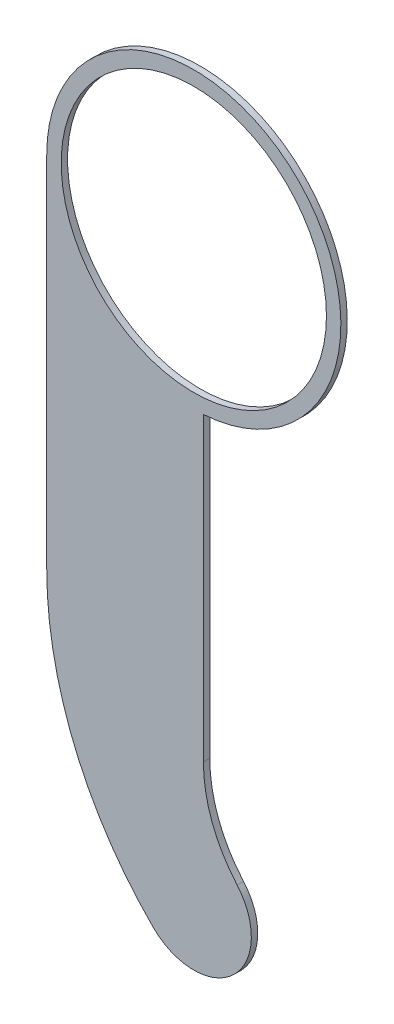
ISO-10303-21;
HEADER;
FILE_DESCRIPTION(('STEP AP214'),'2;1');
FILE_NAME('part.step','',(''),(''),'','','');
FILE_SCHEMA(('AUTOMOTIVE_DESIGN { 1 0 10303 214 1 1 1 1 }'));
ENDSEC;
DATA;
#1=APPLICATION_CONTEXT('core data for automotive mechanical design processes');
#2=APPLICATION_PROTOCOL_DEFINITION('international standard','automotive_design',2000,#1);
#3=PRODUCT_CONTEXT('',#1,'mechanical');
#4=PRODUCT('Part','Part','',(#3));
#5=PRODUCT_RELATED_PRODUCT_CATEGORY('part','',(#4));
#6=PRODUCT_DEFINITION_FORMATION('','',#4);
#7=PRODUCT_DEFINITION_CONTEXT('part definition',#1,'design');
#8=PRODUCT_DEFINITION('design','',#6,#7);
#9=PRODUCT_DEFINITION_SHAPE('','',#8);
#10=(LENGTH_UNIT() NAMED_UNIT(*) SI_UNIT(.MILLI.,.METRE.));
#11=(NAMED_UNIT(*) PLANE_ANGLE_UNIT() SI_UNIT($,.RADIAN.));
#12=(NAMED_UNIT(*) SI_UNIT($,.STERADIAN.) SOLID_ANGLE_UNIT());
#13=UNCERTAINTY_MEASURE_WITH_UNIT(LENGTH_MEASURE(1.E-05),#10,'distance_accuracy_value','');
#14=(GEOMETRIC_REPRESENTATION_CONTEXT(3) GLOBAL_UNCERTAINTY_ASSIGNED_CONTEXT((#13)) GLOBAL_UNIT_ASSIGNED_CONTEXT((#10,
#11,#12)) REPRESENTATION_CONTEXT('',''));
#15=CARTESIAN_POINT('',(0.,0.,0.));
#16=DIRECTION('',(0.,0.,1.));
#17=DIRECTION('',(1.,0.,0.));
#18=AXIS2_PLACEMENT_3D('',#15,#16,#17);
#19=CARTESIAN_POINT('',(45.6573360160041,-140.066053532363,2.));
#20=DIRECTION('',(0.,0.,-1.));
#21=DIRECTION('',(-1.,0.,0.));
#22=AXIS2_PLACEMENT_3D('',#19,#20,#21);
#23=PLANE('',#22);
#24=CARTESIAN_POINT('',(45.6573360160041,-140.066053532363,2.));
#25=DIRECTION('',(0.,0.,-1.));
#26=DIRECTION('',(-1.,0.,0.));
#27=AXIS2_PLACEMENT_3D('',#24,#25,#26);
#28=CIRCLE('',#27,42.6573360160041);
#29=CARTESIAN_POINT('',(13.5487659410436,-168.149643824981,2.));
#30=VERTEX_POINT('',#29);
#31=CARTESIAN_POINT('',(3.00000000000001,-140.066053532363,2.));
#32=VERTEX_POINT('',#31);
#33=EDGE_CURVE('E146',#30,#32,#28,.T.);
#34=ORIENTED_EDGE('',*,*,#33,.T.);
#35=DIRECTION('',(0.,1.,0.));
#36=VECTOR('',#35,1.);
#37=CARTESIAN_POINT('',(3.00000000000001,-140.066053532363,2.));
#38=LINE('',#37,#36);
#39=CARTESIAN_POINT('',(3.00000000000004,-45.9188278959344,2.));
#40=VERTEX_POINT('',#39);
#41=EDGE_CURVE('E94',#32,#40,#38,.T.);
#42=ORIENTED_EDGE('',*,*,#41,.T.);
#43=CARTESIAN_POINT('',(0.,0.,2.));
#44=DIRECTION('',(0.,0.,1.));
#45=DIRECTION('',(-1.,0.,0.));
#46=AXIS2_PLACEMENT_3D('',#43,#44,#45);
#47=CIRCLE('',#46,46.0167225618736);
#48=CARTESIAN_POINT('',(-46.0167225618736,0.,2.));
#49=VERTEX_POINT('',#48);
#50=EDGE_CURVE('E107',#40,#49,#47,.T.);
#51=ORIENTED_EDGE('',*,*,#50,.T.);
#52=DIRECTION('',(0.,-1.,0.));
#53=VECTOR('',#52,1.);
#54=CARTESIAN_POINT('',(-46.0167225618736,-112.361648417881,2.));
#55=LINE('',#54,#53);
#56=CARTESIAN_POINT('',(-46.0167225618736,-112.361648417881,2.));
#57=VERTEX_POINT('',#56);
#58=EDGE_CURVE('E101',#49,#57,#55,.T.);
#59=ORIENTED_EDGE('',*,*,#58,.T.);
#60=CARTESIAN_POINT('',(67.6383515821177,-112.361648417881,2.));
#61=DIRECTION('',(0.,0.,1.));
#62=DIRECTION('',(-1.,0.,0.));
#63=AXIS2_PLACEMENT_3D('',#60,#61,#62);
#64=CIRCLE('',#63,113.655074143991);
#65=CARTESIAN_POINT('',(-12.7279220613578,-192.727922061358,2.));
#66=VERTEX_POINT('',#65);
#67=EDGE_CURVE('E105',#57,#66,#64,.T.);
#68=ORIENTED_EDGE('',*,*,#67,.T.);
#69=CARTESIAN_POINT('',(0.,-180.,2.));
#70=DIRECTION('',(0.,0.,1.));
#71=DIRECTION('',(1.,0.,0.));
#72=AXIS2_PLACEMENT_3D('',#69,#70,#71);
#73=CIRCLE('',#72,18.);
#74=EDGE_CURVE('E57',#66,#30,#73,.T.);
#75=ORIENTED_EDGE('',*,*,#74,.T.);
#76=EDGE_LOOP('',(#34,#42,#51,#59,#68,#75));
#77=FACE_BOUND('',#76,.T.);
#78=CARTESIAN_POINT('',(0.,0.,2.));
#79=DIRECTION('',(0.,0.,1.));
#80=DIRECTION('',(1.,0.,0.));
#81=AXIS2_PLACEMENT_3D('',#78,#79,#80);
#82=CIRCLE('',#81,41.5);
#83=CARTESIAN_POINT('',(41.5,0.,2.));
#84=VERTEX_POINT('',#83);
#85=EDGE_CURVE('E134',#84,#84,#82,.T.);
#86=ORIENTED_EDGE('',*,*,#85,.F.);
#87=EDGE_LOOP('',(#86));
#88=FACE_BOUND('',#87,.T.);
#89=ADVANCED_FACE('F39',(#77,#88),#23,.F.);
#90=CARTESIAN_POINT('',(45.6573360160041,-140.066053532363,0.));
#91=DIRECTION('',(0.,0.,-1.));
#92=DIRECTION('',(-1.,0.,0.));
#93=AXIS2_PLACEMENT_3D('',#90,#91,#92);
#94=PLANE('',#93);
#95=CARTESIAN_POINT('',(45.6573360160041,-140.066053532363,0.));
#96=DIRECTION('',(0.,0.,-1.));
#97=DIRECTION('',(-1.,0.,0.));
#98=AXIS2_PLACEMENT_3D('',#95,#96,#97);
#99=CIRCLE('',#98,42.6573360160041);
#100=CARTESIAN_POINT('',(13.5487659410436,-168.149643824981,0.));
#101=VERTEX_POINT('',#100);
#102=CARTESIAN_POINT('',(3.00000000000001,-140.066053532363,0.));
#103=VERTEX_POINT('',#102);
#104=EDGE_CURVE('E129',#101,#103,#99,.T.);
#105=ORIENTED_EDGE('',*,*,#104,.F.);
#106=CARTESIAN_POINT('',(0.,-180.,0.));
#107=DIRECTION('',(0.,0.,1.));
#108=DIRECTION('',(1.,0.,0.));
#109=AXIS2_PLACEMENT_3D('',#106,#107,#108);
#110=CIRCLE('',#109,18.);
#111=CARTESIAN_POINT('',(-12.7279220613578,-192.727922061358,0.));
#112=VERTEX_POINT('',#111);
#113=EDGE_CURVE('E86',#112,#101,#110,.T.);
#114=ORIENTED_EDGE('',*,*,#113,.F.);
#115=CARTESIAN_POINT('',(67.6383515821177,-112.361648417881,0.));
#116=DIRECTION('',(0.,0.,1.));
#117=DIRECTION('',(-1.,0.,0.));
#118=AXIS2_PLACEMENT_3D('',#115,#116,#117);
#119=CIRCLE('',#118,113.655074143991);
#120=CARTESIAN_POINT('',(-46.0167225618736,-112.361648417881,0.));
#121=VERTEX_POINT('',#120);
#122=EDGE_CURVE('E80',#121,#112,#119,.T.);
#123=ORIENTED_EDGE('',*,*,#122,.F.);
#124=DIRECTION('',(0.,-1.,0.));
#125=VECTOR('',#124,1.);
#126=CARTESIAN_POINT('',(-46.0167225618736,-112.361648417881,0.));
#127=LINE('',#126,#125);
#128=CARTESIAN_POINT('',(-46.0167225618736,0.,0.));
#129=VERTEX_POINT('',#128);
#130=EDGE_CURVE('E116',#129,#121,#127,.T.);
#131=ORIENTED_EDGE('',*,*,#130,.F.);
#132=CARTESIAN_POINT('',(0.,0.,0.));
#133=DIRECTION('',(0.,0.,1.));
#134=DIRECTION('',(-1.,0.,0.));
#135=AXIS2_PLACEMENT_3D('',#132,#133,#134);
#136=CIRCLE('',#135,46.0167225618736);
#137=CARTESIAN_POINT('',(3.00000000000004,-45.9188278959344,0.));
#138=VERTEX_POINT('',#137);
#139=EDGE_CURVE('E137',#138,#129,#136,.T.);
#140=ORIENTED_EDGE('',*,*,#139,.F.);
#141=DIRECTION('',(0.,1.,0.));
#142=VECTOR('',#141,1.);
#143=CARTESIAN_POINT('',(3.00000000000001,-140.066053532363,0.));
#144=LINE('',#143,#142);
#145=EDGE_CURVE('E133',#103,#138,#144,.T.);
#146=ORIENTED_EDGE('',*,*,#145,.F.);
#147=EDGE_LOOP('',(#105,#114,#123,#131,#140,#146));
#148=FACE_BOUND('',#147,.T.);
#149=CARTESIAN_POINT('',(0.,0.,0.));
#150=DIRECTION('',(0.,0.,1.));
#151=DIRECTION('',(1.,0.,0.));
#152=AXIS2_PLACEMENT_3D('',#149,#150,#151);
#153=CIRCLE('',#152,41.5);
#154=CARTESIAN_POINT('',(41.5,0.,0.));
#155=VERTEX_POINT('',#154);
#156=EDGE_CURVE('E243',#155,#155,#153,.T.);
#157=ORIENTED_EDGE('',*,*,#156,.T.);
#158=EDGE_LOOP('',(#157));
#159=FACE_BOUND('',#158,.T.);
#160=ADVANCED_FACE('F159',(#148,#159),#94,.T.);
#161=CARTESIAN_POINT('',(45.6573360160041,-140.066053532363,2.));
#162=DIRECTION('',(0.,0.,-1.));
#163=DIRECTION('',(-1.,0.,0.));
#164=AXIS2_PLACEMENT_3D('',#161,#162,#163);
#165=CYLINDRICAL_SURFACE('',#164,42.6573360160041);
#166=ORIENTED_EDGE('',*,*,#104,.T.);
#167=DIRECTION('',(0.,0.,-1.));
#168=VECTOR('',#167,1.);
#169=CARTESIAN_POINT('',(3.00000000000001,-140.066053532363,2.));
#170=LINE('',#169,#168);
#171=EDGE_CURVE('E11',#32,#103,#170,.T.);
#172=ORIENTED_EDGE('',*,*,#171,.F.);
#173=ORIENTED_EDGE('',*,*,#33,.F.);
#174=DIRECTION('',(0.,0.,-1.));
#175=VECTOR('',#174,1.);
#176=CARTESIAN_POINT('',(13.5487659410436,-168.149643824981,2.));
#177=LINE('',#176,#175);
#178=EDGE_CURVE('E125',#30,#101,#177,.T.);
#179=ORIENTED_EDGE('',*,*,#178,.T.);
#180=EDGE_LOOP('',(#166,#172,#173,#179));
#181=FACE_BOUND('',#180,.T.);
#182=ADVANCED_FACE('F41',(#181),#165,.F.);
#183=CARTESIAN_POINT('',(3.00000000000001,-140.066053532363,2.));
#184=DIRECTION('',(-1.,0.,0.));
#185=DIRECTION('',(0.,-1.,0.));
#186=AXIS2_PLACEMENT_3D('',#183,#184,#185);
#187=PLANE('',#186);
#188=ORIENTED_EDGE('',*,*,#145,.T.);
#189=DIRECTION('',(0.,0.,-1.));
#190=VECTOR('',#189,1.);
#191=CARTESIAN_POINT('',(3.00000000000004,-45.9188278959344,2.));
#192=LINE('',#191,#190);
#193=EDGE_CURVE('E49',#40,#138,#192,.T.);
#194=ORIENTED_EDGE('',*,*,#193,.F.);
#195=ORIENTED_EDGE('',*,*,#41,.F.);
#196=ORIENTED_EDGE('',*,*,#171,.T.);
#197=EDGE_LOOP('',(#188,#194,#195,#196));
#198=FACE_BOUND('',#197,.T.);
#199=ADVANCED_FACE('F184',(#198),#187,.F.);
#200=CARTESIAN_POINT('',(0.,0.,2.));
#201=DIRECTION('',(0.,0.,-1.));
#202=DIRECTION('',(-1.,0.,0.));
#203=AXIS2_PLACEMENT_3D('',#200,#201,#202);
#204=CYLINDRICAL_SURFACE('',#203,46.0167225618736);
#205=ORIENTED_EDGE('',*,*,#139,.T.);
#206=DIRECTION('',(0.,0.,-1.));
#207=VECTOR('',#206,1.);
#208=CARTESIAN_POINT('',(-46.0167225618736,0.,2.));
#209=LINE('',#208,#207);
#210=EDGE_CURVE('E118',#49,#129,#209,.T.);
#211=ORIENTED_EDGE('',*,*,#210,.F.);
#212=ORIENTED_EDGE('',*,*,#50,.F.);
#213=ORIENTED_EDGE('',*,*,#193,.T.);
#214=EDGE_LOOP('',(#205,#211,#212,#213));
#215=FACE_BOUND('',#214,.T.);
#216=ADVANCED_FACE('F156',(#215),#204,.T.);
#217=CARTESIAN_POINT('',(-46.0167225618736,-112.361648417881,2.));
#218=DIRECTION('',(1.,0.,0.));
#219=DIRECTION('',(0.,1.,0.));
#220=AXIS2_PLACEMENT_3D('',#217,#218,#219);
#221=PLANE('',#220);
#222=ORIENTED_EDGE('',*,*,#130,.T.);
#223=DIRECTION('',(0.,0.,-1.));
#224=VECTOR('',#223,1.);
#225=CARTESIAN_POINT('',(-46.0167225618736,-112.361648417881,2.));
#226=LINE('',#225,#224);
#227=EDGE_CURVE('E113',#57,#121,#226,.T.);
#228=ORIENTED_EDGE('',*,*,#227,.F.);
#229=ORIENTED_EDGE('',*,*,#58,.F.);
#230=ORIENTED_EDGE('',*,*,#210,.T.);
#231=EDGE_LOOP('',(#222,#228,#229,#230));
#232=FACE_BOUND('',#231,.T.);
#233=ADVANCED_FACE('F114',(#232),#221,.F.);
#234=CARTESIAN_POINT('',(67.6383515821177,-112.361648417881,2.));
#235=DIRECTION('',(0.,0.,-1.));
#236=DIRECTION('',(-1.,0.,0.));
#237=AXIS2_PLACEMENT_3D('',#234,#235,#236);
#238=CYLINDRICAL_SURFACE('',#237,113.655074143991);
#239=ORIENTED_EDGE('',*,*,#122,.T.);
#240=DIRECTION('',(0.,0.,-1.));
#241=VECTOR('',#240,1.);
#242=CARTESIAN_POINT('',(-12.7279220613578,-192.727922061358,2.));
#243=LINE('',#242,#241);
#244=EDGE_CURVE('E119',#66,#112,#243,.T.);
#245=ORIENTED_EDGE('',*,*,#244,.F.);
#246=ORIENTED_EDGE('',*,*,#67,.F.);
#247=ORIENTED_EDGE('',*,*,#227,.T.);
#248=EDGE_LOOP('',(#239,#245,#246,#247));
#249=FACE_BOUND('',#248,.T.);
#250=ADVANCED_FACE('F121',(#249),#238,.T.);
#251=CARTESIAN_POINT('',(0.,-180.,2.));
#252=DIRECTION('',(0.,0.,-1.));
#253=DIRECTION('',(-1.,0.,0.));
#254=AXIS2_PLACEMENT_3D('',#251,#252,#253);
#255=CYLINDRICAL_SURFACE('',#254,18.);
#256=ORIENTED_EDGE('',*,*,#113,.T.);
#257=ORIENTED_EDGE('',*,*,#178,.F.);
#258=ORIENTED_EDGE('',*,*,#74,.F.);
#259=ORIENTED_EDGE('',*,*,#244,.T.);
#260=EDGE_LOOP('',(#256,#257,#258,#259));
#261=FACE_BOUND('',#260,.T.);
#262=ADVANCED_FACE('F164',(#261),#255,.T.);
#263=CARTESIAN_POINT('',(0.,0.,2.));
#264=DIRECTION('',(0.,0.,-1.));
#265=DIRECTION('',(-1.,0.,0.));
#266=AXIS2_PLACEMENT_3D('',#263,#264,#265);
#267=CYLINDRICAL_SURFACE('',#266,41.5);
#268=ORIENTED_EDGE('',*,*,#85,.T.);
#269=EDGE_LOOP('',(#268));
#270=FACE_BOUND('',#269,.T.);
#271=ORIENTED_EDGE('',*,*,#156,.F.);
#272=EDGE_LOOP('',(#271));
#273=FACE_BOUND('',#272,.T.);
#274=ADVANCED_FACE('F166',(#270,#273),#267,.F.);
#275=CLOSED_SHELL('',(#89,#160,#182,#199,#216,#233,#250,#262,#274));
#276=MANIFOLD_SOLID_BREP('B2',#275);
#277=ADVANCED_BREP_SHAPE_REPRESENTATION('',(#18,#276),#14);
#278=SHAPE_DEFINITION_REPRESENTATION(#9,#277);
ENDSEC;
END-ISO-10303-21;
